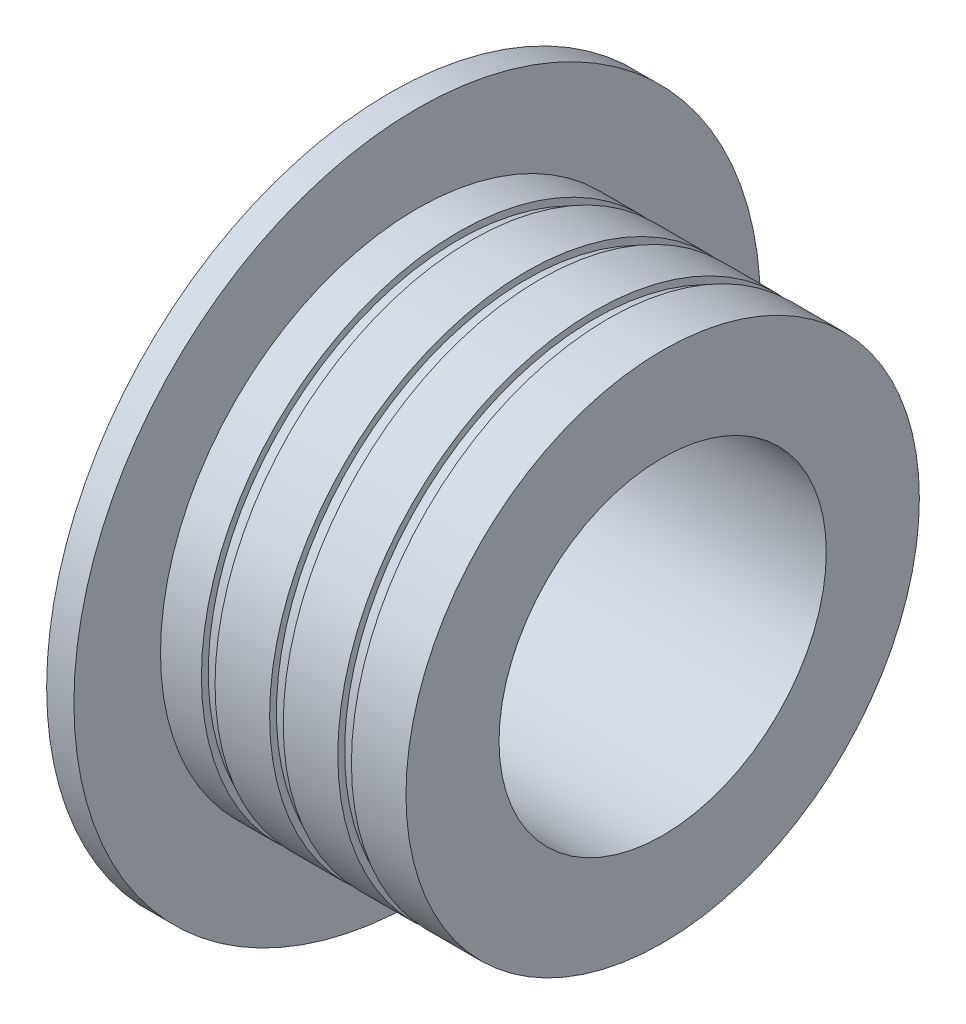
ISO-10303-21;
HEADER;
FILE_DESCRIPTION(('STEP AP214'),'2;1');
FILE_NAME('part.step','',(''),(''),'','','');
FILE_SCHEMA(('AUTOMOTIVE_DESIGN { 1 0 10303 214 1 1 1 1 }'));
ENDSEC;
DATA;
#1=APPLICATION_CONTEXT('core data for automotive mechanical design processes');
#2=APPLICATION_PROTOCOL_DEFINITION('international standard','automotive_design',2000,#1);
#3=PRODUCT_CONTEXT('',#1,'mechanical');
#4=PRODUCT('Part','Part','',(#3));
#5=PRODUCT_RELATED_PRODUCT_CATEGORY('part','',(#4));
#6=PRODUCT_DEFINITION_FORMATION('','',#4);
#7=PRODUCT_DEFINITION_CONTEXT('part definition',#1,'design');
#8=PRODUCT_DEFINITION('design','',#6,#7);
#9=PRODUCT_DEFINITION_SHAPE('','',#8);
#10=(LENGTH_UNIT() NAMED_UNIT(*) SI_UNIT(.MILLI.,.METRE.));
#11=(NAMED_UNIT(*) PLANE_ANGLE_UNIT() SI_UNIT($,.RADIAN.));
#12=(NAMED_UNIT(*) SI_UNIT($,.STERADIAN.) SOLID_ANGLE_UNIT());
#13=UNCERTAINTY_MEASURE_WITH_UNIT(LENGTH_MEASURE(1.E-05),#10,'distance_accuracy_value','');
#14=(GEOMETRIC_REPRESENTATION_CONTEXT(3) GLOBAL_UNCERTAINTY_ASSIGNED_CONTEXT((#13)) GLOBAL_UNIT_ASSIGNED_CONTEXT((#10,
#11,#12)) REPRESENTATION_CONTEXT('',''));
#15=CARTESIAN_POINT('',(0.,0.,0.));
#16=DIRECTION('',(0.,0.,1.));
#17=DIRECTION('',(1.,0.,0.));
#18=AXIS2_PLACEMENT_3D('',#15,#16,#17);
#19=CARTESIAN_POINT('',(-9.25925925925927,-15.9259259259259,0.));
#20=DIRECTION('',(-1.,0.,0.));
#21=DIRECTION('',(0.,0.,1.));
#22=AXIS2_PLACEMENT_3D('',#19,#20,#21);
#23=CYLINDRICAL_SURFACE('',#22,18.825);
#24=CARTESIAN_POINT('',(5.74074074074072,-15.9259259259259,0.));
#25=DIRECTION('',(1.,0.,0.));
#26=DIRECTION('',(0.,0.,-1.));
#27=AXIS2_PLACEMENT_3D('',#24,#25,#26);
#28=CIRCLE('',#27,18.825);
#29=CARTESIAN_POINT('',(5.74074074074072,-15.9259259259259,-18.825));
#30=VERTEX_POINT('',#29);
#31=EDGE_CURVE('E62',#30,#30,#28,.T.);
#32=ORIENTED_EDGE('',*,*,#31,.F.);
#33=EDGE_LOOP('',(#32));
#34=FACE_BOUND('',#33,.T.);
#35=CARTESIAN_POINT('',(1.74074074074072,-15.9259259259259,0.));
#36=DIRECTION('',(1.,0.,0.));
#37=DIRECTION('',(0.,0.,-1.));
#38=AXIS2_PLACEMENT_3D('',#35,#36,#37);
#39=CIRCLE('',#38,18.825);
#40=CARTESIAN_POINT('',(1.74074074074072,-15.9259259259259,-18.825));
#41=VERTEX_POINT('',#40);
#42=EDGE_CURVE('E78',#41,#41,#39,.T.);
#43=ORIENTED_EDGE('',*,*,#42,.T.);
#44=EDGE_LOOP('',(#43));
#45=FACE_BOUND('',#44,.T.);
#46=ADVANCED_FACE('F36',(#34,#45),#23,.T.);
#47=CARTESIAN_POINT('',(10.7407407407407,-15.9259259259259,0.));
#48=DIRECTION('',(-1.,0.,0.));
#49=DIRECTION('',(0.,0.,1.));
#50=AXIS2_PLACEMENT_3D('',#47,#48,#49);
#51=CIRCLE('',#50,18.825);
#52=CARTESIAN_POINT('',(10.7407407407407,-15.9259259259259,18.825));
#53=VERTEX_POINT('',#52);
#54=EDGE_CURVE('E43',#53,#53,#51,.T.);
#55=ORIENTED_EDGE('',*,*,#54,.T.);
#56=EDGE_LOOP('',(#55));
#57=FACE_BOUND('',#56,.T.);
#58=CARTESIAN_POINT('',(6.74074074074072,-15.9259259259259,0.));
#59=DIRECTION('',(1.,0.,0.));
#60=DIRECTION('',(0.,0.,-1.));
#61=AXIS2_PLACEMENT_3D('',#58,#59,#60);
#62=CIRCLE('',#61,18.825);
#63=CARTESIAN_POINT('',(6.74074074074072,-15.9259259259259,-18.825));
#64=VERTEX_POINT('',#63);
#65=EDGE_CURVE('E71',#64,#64,#62,.T.);
#66=ORIENTED_EDGE('',*,*,#65,.T.);
#67=EDGE_LOOP('',(#66));
#68=FACE_BOUND('',#67,.T.);
#69=ADVANCED_FACE('F112',(#57,#68),#23,.T.);
#70=CARTESIAN_POINT('',(-9.25925925925927,-15.9259259259259,0.));
#71=DIRECTION('',(-1.,0.,0.));
#72=DIRECTION('',(0.,0.,1.));
#73=AXIS2_PLACEMENT_3D('',#70,#71,#72);
#74=CYLINDRICAL_SURFACE('',#73,12.);
#75=CARTESIAN_POINT('',(-9.25925925925927,-15.9259259259259,0.));
#76=DIRECTION('',(-1.,0.,0.));
#77=DIRECTION('',(0.,0.,1.));
#78=AXIS2_PLACEMENT_3D('',#75,#76,#77);
#79=CIRCLE('',#78,12.);
#80=CARTESIAN_POINT('',(-9.25925925925927,-15.9259259259259,12.));
#81=VERTEX_POINT('',#80);
#82=EDGE_CURVE('E59',#81,#81,#79,.T.);
#83=ORIENTED_EDGE('',*,*,#82,.T.);
#84=EDGE_LOOP('',(#83));
#85=FACE_BOUND('',#84,.T.);
#86=CARTESIAN_POINT('',(10.7407407407407,-15.9259259259259,0.));
#87=DIRECTION('',(-1.,0.,0.));
#88=DIRECTION('',(0.,0.,1.));
#89=AXIS2_PLACEMENT_3D('',#86,#87,#88);
#90=CIRCLE('',#89,12.);
#91=CARTESIAN_POINT('',(10.7407407407407,-15.9259259259259,12.));
#92=VERTEX_POINT('',#91);
#93=EDGE_CURVE('E10',#92,#92,#90,.T.);
#94=ORIENTED_EDGE('',*,*,#93,.F.);
#95=EDGE_LOOP('',(#94));
#96=FACE_BOUND('',#95,.T.);
#97=ADVANCED_FACE('F38',(#85,#96),#74,.F.);
#98=CARTESIAN_POINT('',(10.7407407407407,0.,0.));
#99=DIRECTION('',(1.,0.,0.));
#100=DIRECTION('',(0.,0.,-1.));
#101=AXIS2_PLACEMENT_3D('',#98,#99,#100);
#102=PLANE('',#101);
#103=ORIENTED_EDGE('',*,*,#93,.T.);
#104=EDGE_LOOP('',(#103));
#105=FACE_BOUND('',#104,.T.);
#106=ORIENTED_EDGE('',*,*,#54,.F.);
#107=EDGE_LOOP('',(#106));
#108=FACE_BOUND('',#107,.T.);
#109=ADVANCED_FACE('F126',(#105,#108),#102,.T.);
#110=CARTESIAN_POINT('',(-4.25925925925928,-15.9259259259259,0.));
#111=DIRECTION('',(1.,0.,0.));
#112=DIRECTION('',(0.,0.,-1.));
#113=AXIS2_PLACEMENT_3D('',#110,#111,#112);
#114=CIRCLE('',#113,18.825);
#115=CARTESIAN_POINT('',(-4.25925925925928,-15.9259259259259,-18.825));
#116=VERTEX_POINT('',#115);
#117=EDGE_CURVE('E75',#116,#116,#114,.T.);
#118=ORIENTED_EDGE('',*,*,#117,.F.);
#119=EDGE_LOOP('',(#118));
#120=FACE_BOUND('',#119,.T.);
#121=CARTESIAN_POINT('',(-7.25925925925927,-15.9259259259259,0.));
#122=DIRECTION('',(-1.,0.,0.));
#123=DIRECTION('',(0.,0.,1.));
#124=AXIS2_PLACEMENT_3D('',#121,#122,#123);
#125=CIRCLE('',#124,18.825);
#126=CARTESIAN_POINT('',(-7.25925925925927,-15.9259259259259,18.825));
#127=VERTEX_POINT('',#126);
#128=EDGE_CURVE('E47',#127,#127,#125,.T.);
#129=ORIENTED_EDGE('',*,*,#128,.F.);
#130=EDGE_LOOP('',(#129));
#131=FACE_BOUND('',#130,.T.);
#132=ADVANCED_FACE('F118',(#120,#131),#23,.T.);
#133=CARTESIAN_POINT('',(-7.25925925925927,0.,0.));
#134=DIRECTION('',(1.,0.,0.));
#135=DIRECTION('',(0.,0.,-1.));
#136=AXIS2_PLACEMENT_3D('',#133,#134,#135);
#137=PLANE('',#136);
#138=ORIENTED_EDGE('',*,*,#128,.T.);
#139=EDGE_LOOP('',(#138));
#140=FACE_BOUND('',#139,.T.);
#141=CARTESIAN_POINT('',(-7.25925925925927,-15.9259259259259,0.));
#142=DIRECTION('',(-1.,0.,0.));
#143=DIRECTION('',(0.,0.,1.));
#144=AXIS2_PLACEMENT_3D('',#141,#142,#143);
#145=CIRCLE('',#144,25.175);
#146=CARTESIAN_POINT('',(-7.25925925925927,-15.9259259259259,25.175));
#147=VERTEX_POINT('',#146);
#148=EDGE_CURVE('E51',#147,#147,#145,.T.);
#149=ORIENTED_EDGE('',*,*,#148,.F.);
#150=EDGE_LOOP('',(#149));
#151=FACE_BOUND('',#150,.T.);
#152=ADVANCED_FACE('F125',(#140,#151),#137,.T.);
#153=CARTESIAN_POINT('',(-9.25925925925927,-15.9259259259259,0.));
#154=DIRECTION('',(-1.,0.,0.));
#155=DIRECTION('',(0.,0.,1.));
#156=AXIS2_PLACEMENT_3D('',#153,#154,#155);
#157=CYLINDRICAL_SURFACE('',#156,25.175);
#158=CARTESIAN_POINT('',(-9.25925925925927,-15.9259259259259,0.));
#159=DIRECTION('',(-1.,0.,0.));
#160=DIRECTION('',(0.,0.,1.));
#161=AXIS2_PLACEMENT_3D('',#158,#159,#160);
#162=CIRCLE('',#161,25.175);
#163=CARTESIAN_POINT('',(-9.25925925925927,-15.9259259259259,25.175));
#164=VERTEX_POINT('',#163);
#165=EDGE_CURVE('E56',#164,#164,#162,.T.);
#166=ORIENTED_EDGE('',*,*,#165,.F.);
#167=EDGE_LOOP('',(#166));
#168=FACE_BOUND('',#167,.T.);
#169=ORIENTED_EDGE('',*,*,#148,.T.);
#170=EDGE_LOOP('',(#169));
#171=FACE_BOUND('',#170,.T.);
#172=ADVANCED_FACE('F132',(#168,#171),#157,.T.);
#173=CARTESIAN_POINT('',(-9.25925925925927,0.,0.));
#174=DIRECTION('',(1.,0.,0.));
#175=DIRECTION('',(0.,0.,-1.));
#176=AXIS2_PLACEMENT_3D('',#173,#174,#175);
#177=PLANE('',#176);
#178=ORIENTED_EDGE('',*,*,#82,.F.);
#179=EDGE_LOOP('',(#178));
#180=FACE_BOUND('',#179,.T.);
#181=ORIENTED_EDGE('',*,*,#165,.T.);
#182=EDGE_LOOP('',(#181));
#183=FACE_BOUND('',#182,.T.);
#184=ADVANCED_FACE('F141',(#180,#183),#177,.F.);
#185=CARTESIAN_POINT('',(5.74074074074072,0.,0.));
#186=DIRECTION('',(-1.,0.,0.));
#187=DIRECTION('',(0.,0.,1.));
#188=AXIS2_PLACEMENT_3D('',#185,#186,#187);
#189=PLANE('',#188);
#190=CARTESIAN_POINT('',(5.74074074074072,-15.9259259259259,0.));
#191=DIRECTION('',(1.,0.,0.));
#192=DIRECTION('',(0.,0.,-1.));
#193=AXIS2_PLACEMENT_3D('',#190,#191,#192);
#194=CIRCLE('',#193,18.325);
#195=CARTESIAN_POINT('',(5.74074074074072,-15.9259259259259,-18.325));
#196=VERTEX_POINT('',#195);
#197=EDGE_CURVE('E65',#196,#196,#194,.T.);
#198=ORIENTED_EDGE('',*,*,#197,.F.);
#199=EDGE_LOOP('',(#198));
#200=FACE_BOUND('',#199,.T.);
#201=ORIENTED_EDGE('',*,*,#31,.T.);
#202=EDGE_LOOP('',(#201));
#203=FACE_BOUND('',#202,.T.);
#204=ADVANCED_FACE('F147',(#200,#203),#189,.F.);
#205=CARTESIAN_POINT('',(10.7407407407407,-15.9259259259259,0.));
#206=DIRECTION('',(1.,0.,0.));
#207=DIRECTION('',(0.,0.,-1.));
#208=AXIS2_PLACEMENT_3D('',#205,#206,#207);
#209=CYLINDRICAL_SURFACE('',#208,18.325);
#210=ORIENTED_EDGE('',*,*,#197,.T.);
#211=EDGE_LOOP('',(#210));
#212=FACE_BOUND('',#211,.T.);
#213=CARTESIAN_POINT('',(6.74074074074072,-15.9259259259259,0.));
#214=DIRECTION('',(1.,0.,0.));
#215=DIRECTION('',(0.,0.,-1.));
#216=AXIS2_PLACEMENT_3D('',#213,#214,#215);
#217=CIRCLE('',#216,18.325);
#218=CARTESIAN_POINT('',(6.74074074074072,-15.9259259259259,-18.325));
#219=VERTEX_POINT('',#218);
#220=EDGE_CURVE('E68',#219,#219,#217,.T.);
#221=ORIENTED_EDGE('',*,*,#220,.F.);
#222=EDGE_LOOP('',(#221));
#223=FACE_BOUND('',#222,.T.);
#224=ADVANCED_FACE('F154',(#212,#223),#209,.T.);
#225=CARTESIAN_POINT('',(6.74074074074072,0.,0.));
#226=DIRECTION('',(-1.,0.,0.));
#227=DIRECTION('',(0.,0.,1.));
#228=AXIS2_PLACEMENT_3D('',#225,#226,#227);
#229=PLANE('',#228);
#230=ORIENTED_EDGE('',*,*,#220,.T.);
#231=EDGE_LOOP('',(#230));
#232=FACE_BOUND('',#231,.T.);
#233=ORIENTED_EDGE('',*,*,#65,.F.);
#234=EDGE_LOOP('',(#233));
#235=FACE_BOUND('',#234,.T.);
#236=ADVANCED_FACE('F158',(#232,#235),#229,.T.);
#237=CARTESIAN_POINT('',(-4.25925925925928,0.,0.));
#238=DIRECTION('',(-1.,0.,0.));
#239=DIRECTION('',(0.,0.,1.));
#240=AXIS2_PLACEMENT_3D('',#237,#238,#239);
#241=PLANE('',#240);
#242=CARTESIAN_POINT('',(-4.25925925925928,-15.9259259259259,0.));
#243=DIRECTION('',(1.,0.,0.));
#244=DIRECTION('',(0.,0.,-1.));
#245=AXIS2_PLACEMENT_3D('',#242,#243,#244);
#246=CIRCLE('',#245,18.325);
#247=CARTESIAN_POINT('',(-4.25925925925928,-15.9259259259259,-18.325));
#248=VERTEX_POINT('',#247);
#249=EDGE_CURVE('E79',#248,#248,#246,.T.);
#250=ORIENTED_EDGE('',*,*,#249,.F.);
#251=EDGE_LOOP('',(#250));
#252=FACE_BOUND('',#251,.T.);
#253=ORIENTED_EDGE('',*,*,#117,.T.);
#254=EDGE_LOOP('',(#253));
#255=FACE_BOUND('',#254,.T.);
#256=ADVANCED_FACE('F162',(#252,#255),#241,.F.);
#257=CARTESIAN_POINT('',(10.7407407407407,-15.9259259259259,0.));
#258=DIRECTION('',(1.,0.,0.));
#259=DIRECTION('',(0.,0.,-1.));
#260=AXIS2_PLACEMENT_3D('',#257,#258,#259);
#261=CYLINDRICAL_SURFACE('',#260,18.325);
#262=ORIENTED_EDGE('',*,*,#249,.T.);
#263=EDGE_LOOP('',(#262));
#264=FACE_BOUND('',#263,.T.);
#265=CARTESIAN_POINT('',(-3.25925925925928,-15.9259259259259,0.));
#266=DIRECTION('',(1.,0.,0.));
#267=DIRECTION('',(0.,0.,-1.));
#268=AXIS2_PLACEMENT_3D('',#265,#266,#267);
#269=CIRCLE('',#268,18.325);
#270=CARTESIAN_POINT('',(-3.25925925925928,-15.9259259259259,-18.325));
#271=VERTEX_POINT('',#270);
#272=EDGE_CURVE('E82',#271,#271,#269,.T.);
#273=ORIENTED_EDGE('',*,*,#272,.F.);
#274=EDGE_LOOP('',(#273));
#275=FACE_BOUND('',#274,.T.);
#276=ADVANCED_FACE('F166',(#264,#275),#261,.T.);
#277=CARTESIAN_POINT('',(-3.25925925925928,0.,0.));
#278=DIRECTION('',(-1.,0.,0.));
#279=DIRECTION('',(0.,0.,1.));
#280=AXIS2_PLACEMENT_3D('',#277,#278,#279);
#281=PLANE('',#280);
#282=ORIENTED_EDGE('',*,*,#272,.T.);
#283=EDGE_LOOP('',(#282));
#284=FACE_BOUND('',#283,.T.);
#285=CARTESIAN_POINT('',(-3.25925925925928,-15.9259259259259,0.));
#286=DIRECTION('',(1.,0.,0.));
#287=DIRECTION('',(0.,0.,-1.));
#288=AXIS2_PLACEMENT_3D('',#285,#286,#287);
#289=CIRCLE('',#288,18.825);
#290=CARTESIAN_POINT('',(-3.25925925925928,-15.9259259259259,-18.825));
#291=VERTEX_POINT('',#290);
#292=EDGE_CURVE('E85',#291,#291,#289,.T.);
#293=ORIENTED_EDGE('',*,*,#292,.F.);
#294=EDGE_LOOP('',(#293));
#295=FACE_BOUND('',#294,.T.);
#296=ADVANCED_FACE('F170',(#284,#295),#281,.T.);
#297=CARTESIAN_POINT('',(0.740740740740718,0.,0.));
#298=DIRECTION('',(-1.,0.,0.));
#299=DIRECTION('',(0.,0.,1.));
#300=AXIS2_PLACEMENT_3D('',#297,#298,#299);
#301=PLANE('',#300);
#302=CARTESIAN_POINT('',(0.740740740740719,-15.9259259259259,0.));
#303=DIRECTION('',(1.,0.,0.));
#304=DIRECTION('',(0.,0.,-1.));
#305=AXIS2_PLACEMENT_3D('',#302,#303,#304);
#306=CIRCLE('',#305,18.325);
#307=CARTESIAN_POINT('',(0.740740740740719,-15.9259259259259,-18.325));
#308=VERTEX_POINT('',#307);
#309=EDGE_CURVE('E90',#308,#308,#306,.T.);
#310=ORIENTED_EDGE('',*,*,#309,.F.);
#311=EDGE_LOOP('',(#310));
#312=FACE_BOUND('',#311,.T.);
#313=CARTESIAN_POINT('',(0.740740740740719,-15.9259259259259,0.));
#314=DIRECTION('',(1.,0.,0.));
#315=DIRECTION('',(0.,0.,-1.));
#316=AXIS2_PLACEMENT_3D('',#313,#314,#315);
#317=CIRCLE('',#316,18.825);
#318=CARTESIAN_POINT('',(0.740740740740719,-15.9259259259259,-18.825));
#319=VERTEX_POINT('',#318);
#320=EDGE_CURVE('E74',#319,#319,#317,.T.);
#321=ORIENTED_EDGE('',*,*,#320,.T.);
#322=EDGE_LOOP('',(#321));
#323=FACE_BOUND('',#322,.T.);
#324=ADVANCED_FACE('F113',(#312,#323),#301,.F.);
#325=CARTESIAN_POINT('',(10.7407407407407,-15.9259259259259,0.));
#326=DIRECTION('',(1.,0.,0.));
#327=DIRECTION('',(0.,0.,-1.));
#328=AXIS2_PLACEMENT_3D('',#325,#326,#327);
#329=CYLINDRICAL_SURFACE('',#328,18.325);
#330=ORIENTED_EDGE('',*,*,#309,.T.);
#331=EDGE_LOOP('',(#330));
#332=FACE_BOUND('',#331,.T.);
#333=CARTESIAN_POINT('',(1.74074074074072,-15.9259259259259,0.));
#334=DIRECTION('',(1.,0.,0.));
#335=DIRECTION('',(0.,0.,-1.));
#336=AXIS2_PLACEMENT_3D('',#333,#334,#335);
#337=CIRCLE('',#336,18.325);
#338=CARTESIAN_POINT('',(1.74074074074072,-15.9259259259259,-18.325));
#339=VERTEX_POINT('',#338);
#340=EDGE_CURVE('E93',#339,#339,#337,.T.);
#341=ORIENTED_EDGE('',*,*,#340,.F.);
#342=EDGE_LOOP('',(#341));
#343=FACE_BOUND('',#342,.T.);
#344=ADVANCED_FACE('F103',(#332,#343),#329,.T.);
#345=CARTESIAN_POINT('',(1.74074074074072,0.,0.));
#346=DIRECTION('',(-1.,0.,0.));
#347=DIRECTION('',(0.,0.,1.));
#348=AXIS2_PLACEMENT_3D('',#345,#346,#347);
#349=PLANE('',#348);
#350=ORIENTED_EDGE('',*,*,#340,.T.);
#351=EDGE_LOOP('',(#350));
#352=FACE_BOUND('',#351,.T.);
#353=ORIENTED_EDGE('',*,*,#42,.F.);
#354=EDGE_LOOP('',(#353));
#355=FACE_BOUND('',#354,.T.);
#356=ADVANCED_FACE('F100',(#352,#355),#349,.T.);
#357=ORIENTED_EDGE('',*,*,#320,.F.);
#358=EDGE_LOOP('',(#357));
#359=FACE_BOUND('',#358,.T.);
#360=ORIENTED_EDGE('',*,*,#292,.T.);
#361=EDGE_LOOP('',(#360));
#362=FACE_BOUND('',#361,.T.);
#363=ADVANCED_FACE('F102',(#359,#362),#23,.T.);
#364=CLOSED_SHELL('',(#46,#69,#97,#109,#132,#152,#172,#184,#204,#224,#236,#256,#276,#296,#324,
#344,#356,#363));
#365=MANIFOLD_SOLID_BREP('B2',#364);
#366=ADVANCED_BREP_SHAPE_REPRESENTATION('',(#18,#365),#14);
#367=SHAPE_DEFINITION_REPRESENTATION(#9,#366);
ENDSEC;
END-ISO-10303-21;
